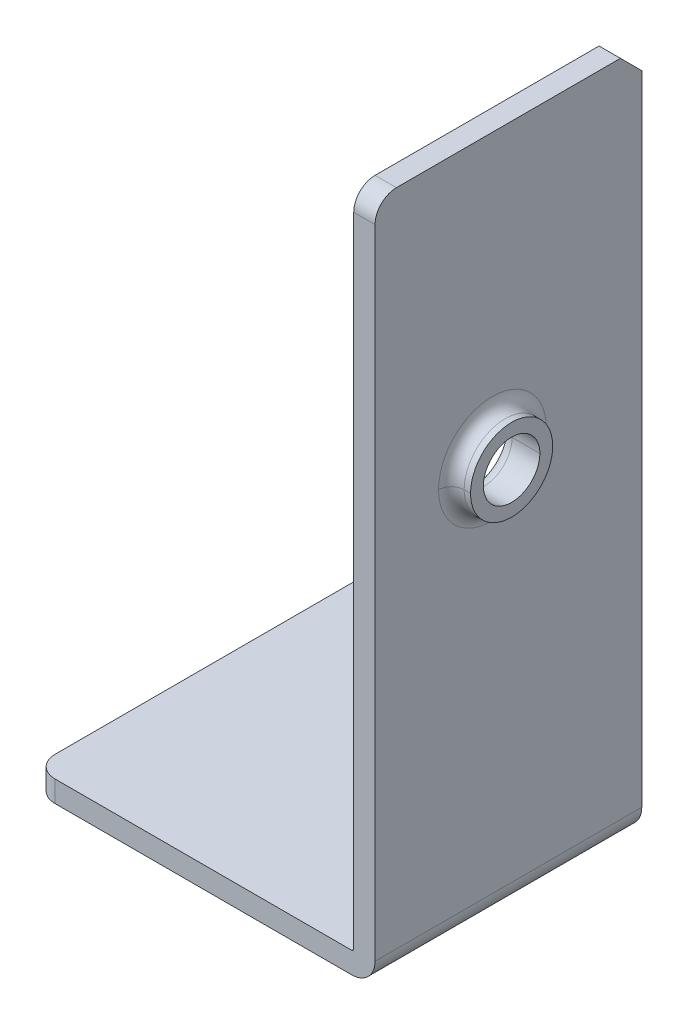
ISO-10303-21;
HEADER;
FILE_DESCRIPTION(('STEP AP214'),'2;1');
FILE_NAME('part.step','',(''),(''),'','','');
FILE_SCHEMA(('AUTOMOTIVE_DESIGN { 1 0 10303 214 1 1 1 1 }'));
ENDSEC;
DATA;
#1=APPLICATION_CONTEXT('core data for automotive mechanical design processes');
#2=APPLICATION_PROTOCOL_DEFINITION('international standard','automotive_design',2000,#1);
#3=PRODUCT_CONTEXT('',#1,'mechanical');
#4=PRODUCT('Part','Part','',(#3));
#5=PRODUCT_RELATED_PRODUCT_CATEGORY('part','',(#4));
#6=PRODUCT_DEFINITION_FORMATION('','',#4);
#7=PRODUCT_DEFINITION_CONTEXT('part definition',#1,'design');
#8=PRODUCT_DEFINITION('design','',#6,#7);
#9=PRODUCT_DEFINITION_SHAPE('','',#8);
#10=(LENGTH_UNIT() NAMED_UNIT(*) SI_UNIT(.MILLI.,.METRE.));
#11=(NAMED_UNIT(*) PLANE_ANGLE_UNIT() SI_UNIT($,.RADIAN.));
#12=(NAMED_UNIT(*) SI_UNIT($,.STERADIAN.) SOLID_ANGLE_UNIT());
#13=UNCERTAINTY_MEASURE_WITH_UNIT(LENGTH_MEASURE(1.E-05),#10,'distance_accuracy_value','');
#14=(GEOMETRIC_REPRESENTATION_CONTEXT(3) GLOBAL_UNCERTAINTY_ASSIGNED_CONTEXT((#13)) GLOBAL_UNIT_ASSIGNED_CONTEXT((#10,
#11,#12)) REPRESENTATION_CONTEXT('',''));
#15=CARTESIAN_POINT('',(0.,0.,0.));
#16=DIRECTION('',(0.,0.,1.));
#17=DIRECTION('',(1.,0.,0.));
#18=AXIS2_PLACEMENT_3D('',#15,#16,#17);
#19=CARTESIAN_POINT('',(-229.56652480921,281.7745818723,13.));
#20=DIRECTION('',(-1.,0.,0.));
#21=DIRECTION('',(0.,0.,1.));
#22=AXIS2_PLACEMENT_3D('',#19,#20,#21);
#23=TOROIDAL_SURFACE('',#22,2.525,0.6);
#24=CARTESIAN_POINT('',(-229.56652480921,281.7745818723,15.525));
#25=DIRECTION('',(0.,-1.,0.));
#26=DIRECTION('',(-1.,0.,0.));
#27=AXIS2_PLACEMENT_3D('',#24,#25,#26);
#28=CIRCLE('',#27,0.6);
#29=CARTESIAN_POINT('',(-230.16652480921,281.7745818723,15.525));
#30=VERTEX_POINT('',#29);
#31=CARTESIAN_POINT('',(-229.56652480921,281.7745818723,14.925));
#32=VERTEX_POINT('',#31);
#33=EDGE_CURVE('E11',#30,#32,#28,.T.);
#34=ORIENTED_EDGE('',*,*,#33,.F.);
#35=CARTESIAN_POINT('',(-230.16652480921,281.7745818723,13.));
#36=DIRECTION('',(-1.,0.,0.));
#37=DIRECTION('',(0.,0.,-1.));
#38=AXIS2_PLACEMENT_3D('',#35,#36,#37);
#39=CIRCLE('',#38,2.525);
#40=CARTESIAN_POINT('',(-230.16652480921,281.7745818723,10.475));
#41=VERTEX_POINT('',#40);
#42=EDGE_CURVE('E190',#41,#30,#39,.T.);
#43=ORIENTED_EDGE('',*,*,#42,.F.);
#44=CARTESIAN_POINT('',(-229.56652480921,281.7745818723,10.475));
#45=DIRECTION('',(0.,1.,0.));
#46=DIRECTION('',(-1.,0.,0.));
#47=AXIS2_PLACEMENT_3D('',#44,#45,#46);
#48=CIRCLE('',#47,0.6);
#49=CARTESIAN_POINT('',(-229.56652480921,281.7745818723,11.075));
#50=VERTEX_POINT('',#49);
#51=EDGE_CURVE('E25',#41,#50,#48,.T.);
#52=ORIENTED_EDGE('',*,*,#51,.T.);
#53=CARTESIAN_POINT('',(-229.56652480921,281.7745818723,13.));
#54=DIRECTION('',(-1.,0.,0.));
#55=DIRECTION('',(0.,0.,-1.));
#56=AXIS2_PLACEMENT_3D('',#53,#54,#55);
#57=CIRCLE('',#56,1.925);
#58=EDGE_CURVE('E76',#50,#32,#57,.T.);
#59=ORIENTED_EDGE('',*,*,#58,.T.);
#60=EDGE_LOOP('',(#34,#43,#52,#59));
#61=FACE_BOUND('',#60,.T.);
#62=ADVANCED_FACE('F16',(#61),#23,.F.);
#63=CARTESIAN_POINT('',(-229.56652480921,281.7745818723,13.));
#64=DIRECTION('',(-1.,0.,0.));
#65=DIRECTION('',(0.,0.,1.));
#66=AXIS2_PLACEMENT_3D('',#63,#64,#65);
#67=TOROIDAL_SURFACE('',#66,2.525,0.6);
#68=CARTESIAN_POINT('',(-229.56652480921,281.7745818723,13.));
#69=DIRECTION('',(-1.,0.,0.));
#70=DIRECTION('',(0.,0.,1.));
#71=AXIS2_PLACEMENT_3D('',#68,#69,#70);
#72=CIRCLE('',#71,1.925);
#73=EDGE_CURVE('E72',#32,#50,#72,.T.);
#74=ORIENTED_EDGE('',*,*,#73,.T.);
#75=ORIENTED_EDGE('',*,*,#51,.F.);
#76=CARTESIAN_POINT('',(-230.16652480921,281.7745818723,13.));
#77=DIRECTION('',(-1.,0.,0.));
#78=DIRECTION('',(0.,0.,1.));
#79=AXIS2_PLACEMENT_3D('',#76,#77,#78);
#80=CIRCLE('',#79,2.525);
#81=EDGE_CURVE('E186',#30,#41,#80,.T.);
#82=ORIENTED_EDGE('',*,*,#81,.F.);
#83=ORIENTED_EDGE('',*,*,#33,.T.);
#84=EDGE_LOOP('',(#74,#75,#82,#83));
#85=FACE_BOUND('',#84,.T.);
#86=ADVANCED_FACE('F689',(#85),#67,.F.);
#87=CARTESIAN_POINT('',(-229.41652480921,281.7745818723,13.));
#88=DIRECTION('',(-1.,0.,0.));
#89=DIRECTION('',(0.,0.,1.));
#90=AXIS2_PLACEMENT_3D('',#87,#88,#89);
#91=CYLINDRICAL_SURFACE('',#90,1.925);
#92=CARTESIAN_POINT('',(-229.26652480921,281.7745818723,13.));
#93=DIRECTION('',(1.,0.,0.));
#94=DIRECTION('',(0.,0.,-1.));
#95=AXIS2_PLACEMENT_3D('',#92,#93,#94);
#96=CIRCLE('',#95,1.925);
#97=CARTESIAN_POINT('',(-229.26652480921,281.7745818723,11.075));
#98=VERTEX_POINT('',#97);
#99=CARTESIAN_POINT('',(-229.26652480921,281.7745818723,14.925));
#100=VERTEX_POINT('',#99);
#101=EDGE_CURVE('E71',#98,#100,#96,.T.);
#102=ORIENTED_EDGE('',*,*,#101,.F.);
#103=DIRECTION('',(1.,0.,0.));
#104=VECTOR('',#103,1.);
#105=CARTESIAN_POINT('',(-229.56652480921,281.7745818723,11.075));
#106=LINE('',#105,#104);
#107=EDGE_CURVE('E81',#50,#98,#106,.T.);
#108=ORIENTED_EDGE('',*,*,#107,.F.);
#109=ORIENTED_EDGE('',*,*,#73,.F.);
#110=DIRECTION('',(1.,0.,0.));
#111=VECTOR('',#110,1.);
#112=CARTESIAN_POINT('',(-229.56652480921,281.7745818723,14.925));
#113=LINE('',#112,#111);
#114=EDGE_CURVE('E66',#32,#100,#113,.T.);
#115=ORIENTED_EDGE('',*,*,#114,.T.);
#116=EDGE_LOOP('',(#102,#108,#109,#115));
#117=FACE_BOUND('',#116,.T.);
#118=ADVANCED_FACE('F68',(#117),#91,.T.);
#119=CARTESIAN_POINT('',(-229.41652480921,281.7745818723,13.));
#120=DIRECTION('',(-1.,0.,0.));
#121=DIRECTION('',(0.,0.,1.));
#122=AXIS2_PLACEMENT_3D('',#119,#120,#121);
#123=CYLINDRICAL_SURFACE('',#122,1.925);
#124=ORIENTED_EDGE('',*,*,#114,.F.);
#125=ORIENTED_EDGE('',*,*,#58,.F.);
#126=ORIENTED_EDGE('',*,*,#107,.T.);
#127=CARTESIAN_POINT('',(-229.26652480921,281.7745818723,13.));
#128=DIRECTION('',(1.,0.,0.));
#129=DIRECTION('',(0.,0.,1.));
#130=AXIS2_PLACEMENT_3D('',#127,#128,#129);
#131=CIRCLE('',#130,1.925);
#132=EDGE_CURVE('E77',#100,#98,#131,.T.);
#133=ORIENTED_EDGE('',*,*,#132,.F.);
#134=EDGE_LOOP('',(#124,#125,#126,#133));
#135=FACE_BOUND('',#134,.T.);
#136=ADVANCED_FACE('F80',(#135),#123,.T.);
#137=CARTESIAN_POINT('',(-229.26652480921,281.7745818723,14.625));
#138=DIRECTION('',(-1.,0.,0.));
#139=DIRECTION('',(0.,-1.,0.));
#140=AXIS2_PLACEMENT_3D('',#137,#138,#139);
#141=PLANE('',#140);
#142=CARTESIAN_POINT('',(-229.26652480921,281.7745818723,13.));
#143=DIRECTION('',(-1.,0.,0.));
#144=DIRECTION('',(0.,0.,1.));
#145=AXIS2_PLACEMENT_3D('',#142,#143,#144);
#146=CIRCLE('',#145,1.325);
#147=CARTESIAN_POINT('',(-229.26652480921,281.7745818723,14.325));
#148=VERTEX_POINT('',#147);
#149=CARTESIAN_POINT('',(-229.26652480921,281.7745818723,11.675));
#150=VERTEX_POINT('',#149);
#151=EDGE_CURVE('E150',#148,#150,#146,.T.);
#152=ORIENTED_EDGE('',*,*,#151,.T.);
#153=CARTESIAN_POINT('',(-229.26652480921,281.7745818723,13.));
#154=DIRECTION('',(-1.,0.,0.));
#155=DIRECTION('',(0.,0.,-1.));
#156=AXIS2_PLACEMENT_3D('',#153,#154,#155);
#157=CIRCLE('',#156,1.325);
#158=EDGE_CURVE('E87',#150,#148,#157,.T.);
#159=ORIENTED_EDGE('',*,*,#158,.T.);
#160=EDGE_LOOP('',(#152,#159));
#161=FACE_BOUND('',#160,.T.);
#162=ORIENTED_EDGE('',*,*,#101,.T.);
#163=ORIENTED_EDGE('',*,*,#132,.T.);
#164=EDGE_LOOP('',(#162,#163));
#165=FACE_BOUND('',#164,.T.);
#166=ADVANCED_FACE('F85',(#161,#165),#141,.F.);
#167=CARTESIAN_POINT('',(-229.91652480921,281.7745818723,13.));
#168=DIRECTION('',(-1.,0.,0.));
#169=DIRECTION('',(0.,0.,1.));
#170=AXIS2_PLACEMENT_3D('',#167,#168,#169);
#171=CYLINDRICAL_SURFACE('',#170,1.325);
#172=DIRECTION('',(1.,0.,0.));
#173=VECTOR('',#172,1.);
#174=CARTESIAN_POINT('',(-230.56652480921,281.7745818723,14.325));
#175=LINE('',#174,#173);
#176=CARTESIAN_POINT('',(-230.56652480921,281.7745818723,14.325));
#177=VERTEX_POINT('',#176);
#178=EDGE_CURVE('E95',#177,#148,#175,.T.);
#179=ORIENTED_EDGE('',*,*,#178,.T.);
#180=ORIENTED_EDGE('',*,*,#158,.F.);
#181=DIRECTION('',(1.,0.,0.));
#182=VECTOR('',#181,1.);
#183=CARTESIAN_POINT('',(-230.56652480921,281.7745818723,11.675));
#184=LINE('',#183,#182);
#185=CARTESIAN_POINT('',(-230.56652480921,281.7745818723,11.675));
#186=VERTEX_POINT('',#185);
#187=EDGE_CURVE('E250',#186,#150,#184,.T.);
#188=ORIENTED_EDGE('',*,*,#187,.F.);
#189=CARTESIAN_POINT('',(-230.56652480921,281.7745818723,13.));
#190=DIRECTION('',(1.,0.,0.));
#191=DIRECTION('',(0.,0.,1.));
#192=AXIS2_PLACEMENT_3D('',#189,#190,#191);
#193=CIRCLE('',#192,1.325);
#194=EDGE_CURVE('E238',#177,#186,#193,.T.);
#195=ORIENTED_EDGE('',*,*,#194,.F.);
#196=EDGE_LOOP('',(#179,#180,#188,#195));
#197=FACE_BOUND('',#196,.T.);
#198=ADVANCED_FACE('F733',(#197),#171,.F.);
#199=CARTESIAN_POINT('',(-229.91652480921,281.7745818723,13.));
#200=DIRECTION('',(-1.,0.,0.));
#201=DIRECTION('',(0.,0.,1.));
#202=AXIS2_PLACEMENT_3D('',#199,#200,#201);
#203=CYLINDRICAL_SURFACE('',#202,1.325);
#204=CARTESIAN_POINT('',(-230.56652480921,281.7745818723,13.));
#205=DIRECTION('',(1.,0.,0.));
#206=DIRECTION('',(0.,0.,-1.));
#207=AXIS2_PLACEMENT_3D('',#204,#205,#206);
#208=CIRCLE('',#207,1.325);
#209=EDGE_CURVE('E246',#186,#177,#208,.T.);
#210=ORIENTED_EDGE('',*,*,#209,.F.);
#211=ORIENTED_EDGE('',*,*,#187,.T.);
#212=ORIENTED_EDGE('',*,*,#151,.F.);
#213=ORIENTED_EDGE('',*,*,#178,.F.);
#214=EDGE_LOOP('',(#210,#211,#212,#213));
#215=FACE_BOUND('',#214,.T.);
#216=ADVANCED_FACE('F711',(#215),#203,.F.);
#217=CARTESIAN_POINT('',(-230.56652480921,281.7745818723,13.));
#218=DIRECTION('',(-1.,0.,0.));
#219=DIRECTION('',(0.,0.,1.));
#220=AXIS2_PLACEMENT_3D('',#217,#218,#219);
#221=TOROIDAL_SURFACE('',#220,1.925,0.6);
#222=CARTESIAN_POINT('',(-231.16652480921,281.7745818723,13.));
#223=DIRECTION('',(1.,0.,0.));
#224=DIRECTION('',(0.,0.,-1.));
#225=AXIS2_PLACEMENT_3D('',#222,#223,#224);
#226=CIRCLE('',#225,1.925);
#227=CARTESIAN_POINT('',(-231.16652480921,281.7745818723,11.075));
#228=VERTEX_POINT('',#227);
#229=CARTESIAN_POINT('',(-231.16652480921,281.7745818723,14.925));
#230=VERTEX_POINT('',#229);
#231=EDGE_CURVE('E229',#228,#230,#226,.T.);
#232=ORIENTED_EDGE('',*,*,#231,.F.);
#233=CARTESIAN_POINT('',(-230.56652480921,281.7745818723,11.075));
#234=DIRECTION('',(0.,1.,0.));
#235=DIRECTION('',(-1.,0.,0.));
#236=AXIS2_PLACEMENT_3D('',#233,#234,#235);
#237=CIRCLE('',#236,0.6);
#238=EDGE_CURVE('E242',#228,#186,#237,.T.);
#239=ORIENTED_EDGE('',*,*,#238,.T.);
#240=ORIENTED_EDGE('',*,*,#209,.T.);
#241=CARTESIAN_POINT('',(-230.56652480921,281.7745818723,14.925));
#242=DIRECTION('',(0.,-1.,0.));
#243=DIRECTION('',(-1.,0.,0.));
#244=AXIS2_PLACEMENT_3D('',#241,#242,#243);
#245=CIRCLE('',#244,0.6);
#246=EDGE_CURVE('E234',#230,#177,#245,.T.);
#247=ORIENTED_EDGE('',*,*,#246,.F.);
#248=EDGE_LOOP('',(#232,#239,#240,#247));
#249=FACE_BOUND('',#248,.T.);
#250=ADVANCED_FACE('F707',(#249),#221,.T.);
#251=CARTESIAN_POINT('',(-230.56652480921,281.7745818723,13.));
#252=DIRECTION('',(-1.,0.,0.));
#253=DIRECTION('',(0.,0.,1.));
#254=AXIS2_PLACEMENT_3D('',#251,#252,#253);
#255=TOROIDAL_SURFACE('',#254,1.925,0.6);
#256=ORIENTED_EDGE('',*,*,#246,.T.);
#257=ORIENTED_EDGE('',*,*,#194,.T.);
#258=ORIENTED_EDGE('',*,*,#238,.F.);
#259=CARTESIAN_POINT('',(-231.16652480921,281.7745818723,13.));
#260=DIRECTION('',(1.,0.,0.));
#261=DIRECTION('',(0.,0.,1.));
#262=AXIS2_PLACEMENT_3D('',#259,#260,#261);
#263=CIRCLE('',#262,1.925);
#264=EDGE_CURVE('E233',#230,#228,#263,.T.);
#265=ORIENTED_EDGE('',*,*,#264,.F.);
#266=EDGE_LOOP('',(#256,#257,#258,#265));
#267=FACE_BOUND('',#266,.T.);
#268=ADVANCED_FACE('F710',(#267),#255,.T.);
#269=CARTESIAN_POINT('',(-231.26652480921,264.1245789185,23.4));
#270=DIRECTION('',(0.,0.,1.));
#271=DIRECTION('',(-1.,0.,0.));
#272=AXIS2_PLACEMENT_3D('',#269,#270,#271);
#273=CYLINDRICAL_SURFACE('',#272,0.1);
#274=CARTESIAN_POINT('',(-231.26652480921,264.1245789185,18.5));
#275=DIRECTION('',(0.,0.,-1.));
#276=DIRECTION('',(1.,-8.526512829122E-13,0.));
#277=AXIS2_PLACEMENT_3D('',#274,#275,#276);
#278=CIRCLE('',#277,0.1);
#279=CARTESIAN_POINT('',(-231.16652480921,264.1245789185,18.5));
#280=VERTEX_POINT('',#279);
#281=CARTESIAN_POINT('',(-231.26652480921,264.0245789185,18.5));
#282=VERTEX_POINT('',#281);
#283=EDGE_CURVE('E124',#280,#282,#278,.T.);
#284=ORIENTED_EDGE('',*,*,#283,.F.);
#285=DIRECTION('',(0.,0.,-1.));
#286=VECTOR('',#285,1.);
#287=CARTESIAN_POINT('',(-231.16652480921,264.1245789185,18.5));
#288=LINE('',#287,#286);
#289=CARTESIAN_POINT('',(-231.16652480921,264.1245789185,5.99999999999991));
#290=VERTEX_POINT('',#289);
#291=EDGE_CURVE('E225',#280,#290,#288,.T.);
#292=ORIENTED_EDGE('',*,*,#291,.T.);
#293=CARTESIAN_POINT('',(-231.26652480921,264.1245789185,5.99999999999991));
#294=DIRECTION('',(0.,0.,1.));
#295=DIRECTION('',(-1.42108547152E-12,-1.,0.));
#296=AXIS2_PLACEMENT_3D('',#293,#294,#295);
#297=CIRCLE('',#296,0.1);
#298=CARTESIAN_POINT('',(-231.26652480921,264.0245789185,5.99999999999991));
#299=VERTEX_POINT('',#298);
#300=EDGE_CURVE('E194',#299,#290,#297,.T.);
#301=ORIENTED_EDGE('',*,*,#300,.F.);
#302=DIRECTION('',(0.,0.,1.));
#303=VECTOR('',#302,1.);
#304=CARTESIAN_POINT('',(-231.26652480921,264.0245789185,5.99999999999991));
#305=LINE('',#304,#303);
#306=EDGE_CURVE('E99',#299,#282,#305,.T.);
#307=ORIENTED_EDGE('',*,*,#306,.T.);
#308=EDGE_LOOP('',(#284,#292,#301,#307));
#309=FACE_BOUND('',#308,.T.);
#310=ADVANCED_FACE('F651',(#309),#273,.F.);
#311=CARTESIAN_POINT('',(-231.16652480921,334.17457891819,0.));
#312=DIRECTION('',(-1.,0.,0.));
#313=DIRECTION('',(0.,-1.,0.));
#314=AXIS2_PLACEMENT_3D('',#311,#312,#313);
#315=PLANE('',#314);
#316=ORIENTED_EDGE('',*,*,#231,.T.);
#317=ORIENTED_EDGE('',*,*,#264,.T.);
#318=EDGE_LOOP('',(#316,#317));
#319=FACE_BOUND('',#318,.T.);
#320=DIRECTION('',(0.,-1.,0.));
#321=VECTOR('',#320,1.);
#322=CARTESIAN_POINT('',(-231.16652480921,294.0245788262,18.5));
#323=LINE('',#322,#321);
#324=CARTESIAN_POINT('',(-231.16652480921,294.0245788262,18.5));
#325=VERTEX_POINT('',#324);
#326=EDGE_CURVE('E119',#325,#280,#323,.T.);
#327=ORIENTED_EDGE('',*,*,#326,.F.);
#328=CARTESIAN_POINT('',(-231.16652480921,294.0245788262,17.5));
#329=DIRECTION('',(-1.,0.,0.));
#330=DIRECTION('',(0.,-7.531752999057E-13,1.));
#331=AXIS2_PLACEMENT_3D('',#328,#329,#330);
#332=CIRCLE('',#331,1.);
#333=CARTESIAN_POINT('',(-231.16652480921,295.0245788262,17.5));
#334=VERTEX_POINT('',#333);
#335=EDGE_CURVE('E222',#325,#334,#332,.T.);
#336=ORIENTED_EDGE('',*,*,#335,.T.);
#337=DIRECTION('',(0.,0.,-1.));
#338=VECTOR('',#337,1.);
#339=CARTESIAN_POINT('',(-231.16652480921,295.0245788262,17.5));
#340=LINE('',#339,#338);
#341=CARTESIAN_POINT('',(-231.16652480921,295.0245788262,6.99999999999991));
#342=VERTEX_POINT('',#341);
#343=EDGE_CURVE('E214',#334,#342,#340,.T.);
#344=ORIENTED_EDGE('',*,*,#343,.T.);
#345=DIRECTION('',(0.,-0.707106781186548,-0.707106781186548));
#346=VECTOR('',#345,1.);
#347=CARTESIAN_POINT('',(-231.16652480921,295.0245788262,6.99999999999991));
#348=LINE('',#347,#346);
#349=CARTESIAN_POINT('',(-231.16652480921,294.0245788262,5.99999999999991));
#350=VERTEX_POINT('',#349);
#351=EDGE_CURVE('E206',#342,#350,#348,.T.);
#352=ORIENTED_EDGE('',*,*,#351,.T.);
#353=DIRECTION('',(0.,-1.,0.));
#354=VECTOR('',#353,1.);
#355=CARTESIAN_POINT('',(-231.16652480921,294.0245788262,5.99999999999991));
#356=LINE('',#355,#354);
#357=EDGE_CURVE('E198',#350,#290,#356,.T.);
#358=ORIENTED_EDGE('',*,*,#357,.T.);
#359=ORIENTED_EDGE('',*,*,#291,.F.);
#360=EDGE_LOOP('',(#327,#336,#344,#352,#358,#359));
#361=FACE_BOUND('',#360,.T.);
#362=ADVANCED_FACE('F637',(#319,#361),#315,.T.);
#363=CARTESIAN_POINT('',(-23.81462961831,294.0245788262,17.5));
#364=DIRECTION('',(-1.,0.,0.));
#365=DIRECTION('',(0.,0.,-1.));
#366=AXIS2_PLACEMENT_3D('',#363,#364,#365);
#367=CYLINDRICAL_SURFACE('',#366,1.);
#368=ORIENTED_EDGE('',*,*,#335,.F.);
#369=DIRECTION('',(1.,0.,0.));
#370=VECTOR('',#369,1.);
#371=CARTESIAN_POINT('',(-231.16652480921,294.0245788262,18.5));
#372=LINE('',#371,#370);
#373=CARTESIAN_POINT('',(-230.16652480921,294.0245788262,18.5));
#374=VERTEX_POINT('',#373);
#375=EDGE_CURVE('E115',#325,#374,#372,.T.);
#376=ORIENTED_EDGE('',*,*,#375,.T.);
#377=CARTESIAN_POINT('',(-230.16652480921,294.0245788262,17.5));
#378=DIRECTION('',(1.,0.,0.));
#379=DIRECTION('',(0.,1.,0.));
#380=AXIS2_PLACEMENT_3D('',#377,#378,#379);
#381=CIRCLE('',#380,1.);
#382=CARTESIAN_POINT('',(-230.16652480921,295.0245788262,17.5));
#383=VERTEX_POINT('',#382);
#384=EDGE_CURVE('E176',#383,#374,#381,.T.);
#385=ORIENTED_EDGE('',*,*,#384,.F.);
#386=DIRECTION('',(-1.,0.,0.));
#387=VECTOR('',#386,1.);
#388=CARTESIAN_POINT('',(-230.16652480921,295.0245788262,17.5));
#389=LINE('',#388,#387);
#390=EDGE_CURVE('E218',#383,#334,#389,.T.);
#391=ORIENTED_EDGE('',*,*,#390,.T.);
#392=EDGE_LOOP('',(#368,#376,#385,#391));
#393=FACE_BOUND('',#392,.T.);
#394=ADVANCED_FACE('F659',(#393),#367,.T.);
#395=CARTESIAN_POINT('',(-225.41652240921,295.0245788262,29.2852188387399));
#396=DIRECTION('',(0.,-1.,0.));
#397=DIRECTION('',(-1.,0.,0.));
#398=AXIS2_PLACEMENT_3D('',#395,#396,#397);
#399=PLANE('',#398);
#400=DIRECTION('',(0.,0.,1.));
#401=VECTOR('',#400,1.);
#402=CARTESIAN_POINT('',(-230.16652480921,295.0245788262,6.99999999999991));
#403=LINE('',#402,#401);
#404=CARTESIAN_POINT('',(-230.16652480921,295.0245788262,6.99999999999991));
#405=VERTEX_POINT('',#404);
#406=EDGE_CURVE('E172',#405,#383,#403,.T.);
#407=ORIENTED_EDGE('',*,*,#406,.F.);
#408=DIRECTION('',(1.,0.,0.));
#409=VECTOR('',#408,1.);
#410=CARTESIAN_POINT('',(-231.16652480921,295.0245788262,6.99999999999991));
#411=LINE('',#410,#409);
#412=EDGE_CURVE('E210',#342,#405,#411,.T.);
#413=ORIENTED_EDGE('',*,*,#412,.F.);
#414=ORIENTED_EDGE('',*,*,#343,.F.);
#415=ORIENTED_EDGE('',*,*,#390,.F.);
#416=EDGE_LOOP('',(#407,#413,#414,#415));
#417=FACE_BOUND('',#416,.T.);
#418=ADVANCED_FACE('F640',(#417),#399,.F.);
#419=CARTESIAN_POINT('',(-230.66652480921,294.5245788262,6.49999999999991));
#420=DIRECTION('',(0.,-0.707106781186598,0.707106781186498));
#421=DIRECTION('',(-1.,0.,0.));
#422=AXIS2_PLACEMENT_3D('',#419,#420,#421);
#423=PLANE('',#422);
#424=ORIENTED_EDGE('',*,*,#351,.F.);
#425=ORIENTED_EDGE('',*,*,#412,.T.);
#426=DIRECTION('',(0.,0.707106781186548,0.707106781186548));
#427=VECTOR('',#426,1.);
#428=CARTESIAN_POINT('',(-230.16652480921,294.0245788262,5.99999999999991));
#429=LINE('',#428,#427);
#430=CARTESIAN_POINT('',(-230.16652480921,294.0245788262,5.99999999999991));
#431=VERTEX_POINT('',#430);
#432=EDGE_CURVE('E166',#431,#405,#429,.T.);
#433=ORIENTED_EDGE('',*,*,#432,.F.);
#434=DIRECTION('',(1.,0.,0.));
#435=VECTOR('',#434,1.);
#436=CARTESIAN_POINT('',(-231.16652480921,294.0245788262,5.99999999999991));
#437=LINE('',#436,#435);
#438=EDGE_CURVE('E202',#350,#431,#437,.T.);
#439=ORIENTED_EDGE('',*,*,#438,.F.);
#440=EDGE_LOOP('',(#424,#425,#433,#439));
#441=FACE_BOUND('',#440,.T.);
#442=ADVANCED_FACE('F643',(#441),#423,.F.);
#443=CARTESIAN_POINT('',(-221.57063322721,261.5245789185,5.99999999999991));
#444=DIRECTION('',(0.,0.,1.));
#445=DIRECTION('',(-1.,0.,0.));
#446=AXIS2_PLACEMENT_3D('',#443,#444,#445);
#447=PLANE('',#446);
#448=DIRECTION('',(0.,1.,0.));
#449=VECTOR('',#448,1.);
#450=CARTESIAN_POINT('',(-230.16652480921,264.1245789185,5.99999999999991));
#451=LINE('',#450,#449);
#452=CARTESIAN_POINT('',(-230.16652480921,264.1245789185,5.99999999999991));
#453=VERTEX_POINT('',#452);
#454=EDGE_CURVE('E180',#453,#431,#451,.T.);
#455=ORIENTED_EDGE('',*,*,#454,.F.);
#456=CARTESIAN_POINT('',(-231.26652480921,264.1245789185,5.99999999999991));
#457=DIRECTION('',(0.,0.,-1.));
#458=DIRECTION('',(1.,0.,0.));
#459=AXIS2_PLACEMENT_3D('',#456,#457,#458);
#460=CIRCLE('',#459,1.1);
#461=CARTESIAN_POINT('',(-231.26652480921,263.0245789185,5.99999999999991));
#462=VERTEX_POINT('',#461);
#463=EDGE_CURVE('E158',#453,#462,#460,.T.);
#464=ORIENTED_EDGE('',*,*,#463,.T.);
#465=DIRECTION('',(1.,0.,0.));
#466=VECTOR('',#465,1.);
#467=CARTESIAN_POINT('',(-240.41652711801,263.0245789185,5.99999999999991));
#468=LINE('',#467,#466);
#469=CARTESIAN_POINT('',(-240.41652711801,263.0245789185,5.99999999999991));
#470=VERTEX_POINT('',#469);
#471=EDGE_CURVE('E142',#470,#462,#468,.T.);
#472=ORIENTED_EDGE('',*,*,#471,.F.);
#473=DIRECTION('',(0.,-1.,0.));
#474=VECTOR('',#473,1.);
#475=CARTESIAN_POINT('',(-240.41652711801,264.0245789185,5.99999999999991));
#476=LINE('',#475,#474);
#477=CARTESIAN_POINT('',(-240.41652711801,264.0245789185,5.99999999999991));
#478=VERTEX_POINT('',#477);
#479=EDGE_CURVE('E471',#478,#470,#476,.T.);
#480=ORIENTED_EDGE('',*,*,#479,.F.);
#481=DIRECTION('',(-1.,0.,0.));
#482=VECTOR('',#481,1.);
#483=CARTESIAN_POINT('',(-231.26652480921,264.0245789185,5.99999999999991));
#484=LINE('',#483,#482);
#485=EDGE_CURVE('E106',#299,#478,#484,.T.);
#486=ORIENTED_EDGE('',*,*,#485,.F.);
#487=ORIENTED_EDGE('',*,*,#300,.T.);
#488=ORIENTED_EDGE('',*,*,#357,.F.);
#489=ORIENTED_EDGE('',*,*,#438,.T.);
#490=EDGE_LOOP('',(#455,#464,#472,#480,#486,#487,#488,#489));
#491=FACE_BOUND('',#490,.T.);
#492=ADVANCED_FACE('F646',(#491),#447,.F.);
#493=CARTESIAN_POINT('',(-230.16652480921,264.1245789185,26.));
#494=DIRECTION('',(1.,0.,0.));
#495=DIRECTION('',(0.,0.,1.));
#496=AXIS2_PLACEMENT_3D('',#493,#494,#495);
#497=PLANE('',#496);
#498=ORIENTED_EDGE('',*,*,#81,.T.);
#499=ORIENTED_EDGE('',*,*,#42,.T.);
#500=EDGE_LOOP('',(#498,#499));
#501=FACE_BOUND('',#500,.T.);
#502=ORIENTED_EDGE('',*,*,#432,.T.);
#503=ORIENTED_EDGE('',*,*,#406,.T.);
#504=ORIENTED_EDGE('',*,*,#384,.T.);
#505=DIRECTION('',(0.,1.,0.));
#506=VECTOR('',#505,1.);
#507=CARTESIAN_POINT('',(-230.16652480921,264.1245789185,18.5));
#508=LINE('',#507,#506);
#509=CARTESIAN_POINT('',(-230.16652480921,264.1245789185,18.5));
#510=VERTEX_POINT('',#509);
#511=EDGE_CURVE('E120',#510,#374,#508,.T.);
#512=ORIENTED_EDGE('',*,*,#511,.F.);
#513=DIRECTION('',(0.,0.,1.));
#514=VECTOR('',#513,1.);
#515=CARTESIAN_POINT('',(-230.16652480921,264.1245789185,5.99999999999991));
#516=LINE('',#515,#514);
#517=EDGE_CURVE('E162',#453,#510,#516,.T.);
#518=ORIENTED_EDGE('',*,*,#517,.F.);
#519=ORIENTED_EDGE('',*,*,#454,.T.);
#520=EDGE_LOOP('',(#502,#503,#504,#512,#518,#519));
#521=FACE_BOUND('',#520,.T.);
#522=ADVANCED_FACE('F661',(#501,#521),#497,.T.);
#523=CARTESIAN_POINT('',(-231.26652480921,264.1245789185,23.4));
#524=DIRECTION('',(0.,0.,1.));
#525=DIRECTION('',(-1.,0.,0.));
#526=AXIS2_PLACEMENT_3D('',#523,#524,#525);
#527=CYLINDRICAL_SURFACE('',#526,1.1);
#528=CARTESIAN_POINT('',(-231.26652480921,264.1245789185,18.5));
#529=DIRECTION('',(0.,0.,1.));
#530=DIRECTION('',(-2.84217094304E-13,-1.,0.));
#531=AXIS2_PLACEMENT_3D('',#528,#529,#530);
#532=CIRCLE('',#531,1.1);
#533=CARTESIAN_POINT('',(-231.26652480921,263.0245789185,18.5));
#534=VERTEX_POINT('',#533);
#535=EDGE_CURVE('E104',#534,#510,#532,.T.);
#536=ORIENTED_EDGE('',*,*,#535,.F.);
#537=DIRECTION('',(0.,0.,-1.));
#538=VECTOR('',#537,1.);
#539=CARTESIAN_POINT('',(-231.26652480921,263.0245789185,18.5));
#540=LINE('',#539,#538);
#541=EDGE_CURVE('E146',#534,#462,#540,.T.);
#542=ORIENTED_EDGE('',*,*,#541,.T.);
#543=ORIENTED_EDGE('',*,*,#463,.F.);
#544=ORIENTED_EDGE('',*,*,#517,.T.);
#545=EDGE_LOOP('',(#536,#542,#543,#544));
#546=FACE_BOUND('',#545,.T.);
#547=ADVANCED_FACE('F667',(#546),#527,.T.);
#548=CARTESIAN_POINT('',(-246.16652480911,261.5245789185,0.));
#549=DIRECTION('',(-1.,0.,0.));
#550=DIRECTION('',(0.,-1.,0.));
#551=AXIS2_PLACEMENT_3D('',#548,#549,#550);
#552=PLANE('',#551);
#553=DIRECTION('',(0.,0.,-1.));
#554=VECTOR('',#553,1.);
#555=CARTESIAN_POINT('',(-246.16652480911,264.0245789185,17.5));
#556=LINE('',#555,#554);
#557=CARTESIAN_POINT('',(-246.16652480911,264.0245789185,17.5));
#558=VERTEX_POINT('',#557);
#559=CARTESIAN_POINT('',(-246.16652480911,264.0245789185,0.));
#560=VERTEX_POINT('',#559);
#561=EDGE_CURVE('E110',#558,#560,#556,.T.);
#562=ORIENTED_EDGE('',*,*,#561,.T.);
#563=DIRECTION('',(0.,1.,0.));
#564=VECTOR('',#563,1.);
#565=CARTESIAN_POINT('',(-246.16652480911,263.0245789185,0.));
#566=LINE('',#565,#564);
#567=CARTESIAN_POINT('',(-246.16652480911,263.0245789185,0.));
#568=VERTEX_POINT('',#567);
#569=EDGE_CURVE('E520',#568,#560,#566,.T.);
#570=ORIENTED_EDGE('',*,*,#569,.F.);
#571=DIRECTION('',(0.,0.,1.));
#572=VECTOR('',#571,1.);
#573=CARTESIAN_POINT('',(-246.16652480911,263.0245789185,0.));
#574=LINE('',#573,#572);
#575=CARTESIAN_POINT('',(-246.16652480911,263.0245789185,17.5));
#576=VERTEX_POINT('',#575);
#577=EDGE_CURVE('E154',#568,#576,#574,.T.);
#578=ORIENTED_EDGE('',*,*,#577,.T.);
#579=DIRECTION('',(0.,-1.,0.));
#580=VECTOR('',#579,1.);
#581=CARTESIAN_POINT('',(-246.16652480911,264.0245789185,17.5));
#582=LINE('',#581,#580);
#583=EDGE_CURVE('E134',#558,#576,#582,.T.);
#584=ORIENTED_EDGE('',*,*,#583,.F.);
#585=EDGE_LOOP('',(#562,#570,#578,#584));
#586=FACE_BOUND('',#585,.T.);
#587=ADVANCED_FACE('F675',(#586),#552,.T.);
#588=CARTESIAN_POINT('',(-229.16652480921,263.0245789185,0.));
#589=DIRECTION('',(0.,-1.,0.));
#590=DIRECTION('',(-1.,0.,0.));
#591=AXIS2_PLACEMENT_3D('',#588,#589,#590);
#592=PLANE('',#591);
#593=DIRECTION('',(-1.,0.,0.));
#594=VECTOR('',#593,1.);
#595=CARTESIAN_POINT('',(-240.41652711801,263.0245789185,0.));
#596=LINE('',#595,#594);
#597=CARTESIAN_POINT('',(-240.41652711801,263.0245789185,0.));
#598=VERTEX_POINT('',#597);
#599=EDGE_CURVE('E535',#598,#568,#596,.T.);
#600=ORIENTED_EDGE('',*,*,#599,.F.);
#601=DIRECTION('',(0.,0.,-1.));
#602=VECTOR('',#601,1.);
#603=CARTESIAN_POINT('',(-240.41652711801,263.0245789185,5.99999999999991));
#604=LINE('',#603,#602);
#605=EDGE_CURVE('E463',#470,#598,#604,.T.);
#606=ORIENTED_EDGE('',*,*,#605,.F.);
#607=ORIENTED_EDGE('',*,*,#471,.T.);
#608=ORIENTED_EDGE('',*,*,#541,.F.);
#609=DIRECTION('',(1.,0.,0.));
#610=VECTOR('',#609,1.);
#611=CARTESIAN_POINT('',(-245.16652480911,263.0245789185,18.5));
#612=LINE('',#611,#610);
#613=CARTESIAN_POINT('',(-245.16652480911,263.0245789185,18.5));
#614=VERTEX_POINT('',#613);
#615=EDGE_CURVE('E101',#614,#534,#612,.T.);
#616=ORIENTED_EDGE('',*,*,#615,.F.);
#617=CARTESIAN_POINT('',(-245.16652480911,263.0245789185,17.5));
#618=DIRECTION('',(0.,-1.,0.));
#619=DIRECTION('',(-1.534772309242E-12,0.,1.));
#620=AXIS2_PLACEMENT_3D('',#617,#618,#619);
#621=CIRCLE('',#620,1.);
#622=EDGE_CURVE('E138',#614,#576,#621,.T.);
#623=ORIENTED_EDGE('',*,*,#622,.T.);
#624=ORIENTED_EDGE('',*,*,#577,.F.);
#625=EDGE_LOOP('',(#600,#606,#607,#608,#616,#623,#624));
#626=FACE_BOUND('',#625,.T.);
#627=ADVANCED_FACE('F571',(#626),#592,.T.);
#628=CARTESIAN_POINT('',(-245.16652480911,419.8300958367,17.5));
#629=DIRECTION('',(0.,1.,0.));
#630=DIRECTION('',(0.,0.,1.));
#631=AXIS2_PLACEMENT_3D('',#628,#629,#630);
#632=CYLINDRICAL_SURFACE('',#631,1.);
#633=CARTESIAN_POINT('',(-245.16652480911,264.0245789185,17.5));
#634=DIRECTION('',(0.,1.,0.));
#635=DIRECTION('',(-1.,0.,0.));
#636=AXIS2_PLACEMENT_3D('',#633,#634,#635);
#637=CIRCLE('',#636,1.);
#638=CARTESIAN_POINT('',(-245.16652480911,264.0245789185,18.5));
#639=VERTEX_POINT('',#638);
#640=EDGE_CURVE('E111',#558,#639,#637,.T.);
#641=ORIENTED_EDGE('',*,*,#640,.F.);
#642=ORIENTED_EDGE('',*,*,#583,.T.);
#643=ORIENTED_EDGE('',*,*,#622,.F.);
#644=DIRECTION('',(0.,1.,0.));
#645=VECTOR('',#644,1.);
#646=CARTESIAN_POINT('',(-245.16652480911,263.0245789185,18.5));
#647=LINE('',#646,#645);
#648=EDGE_CURVE('E128',#614,#639,#647,.T.);
#649=ORIENTED_EDGE('',*,*,#648,.T.);
#650=EDGE_LOOP('',(#641,#642,#643,#649));
#651=FACE_BOUND('',#650,.T.);
#652=ADVANCED_FACE('F672',(#651),#632,.T.);
#653=CARTESIAN_POINT('',(-108.29174169396,369.1289869996,18.5));
#654=DIRECTION('',(0.,0.,1.));
#655=DIRECTION('',(-1.,0.,0.));
#656=AXIS2_PLACEMENT_3D('',#653,#654,#655);
#657=PLANE('',#656);
#658=ORIENTED_EDGE('',*,*,#615,.T.);
#659=ORIENTED_EDGE('',*,*,#535,.T.);
#660=ORIENTED_EDGE('',*,*,#511,.T.);
#661=ORIENTED_EDGE('',*,*,#375,.F.);
#662=ORIENTED_EDGE('',*,*,#326,.T.);
#663=ORIENTED_EDGE('',*,*,#283,.T.);
#664=DIRECTION('',(-1.,0.,0.));
#665=VECTOR('',#664,1.);
#666=CARTESIAN_POINT('',(-231.26652480921,264.0245789185,18.5));
#667=LINE('',#666,#665);
#668=EDGE_CURVE('E105',#282,#639,#667,.T.);
#669=ORIENTED_EDGE('',*,*,#668,.T.);
#670=ORIENTED_EDGE('',*,*,#648,.F.);
#671=EDGE_LOOP('',(#658,#659,#660,#661,#662,#663,#669,#670));
#672=FACE_BOUND('',#671,.T.);
#673=ADVANCED_FACE('F655',(#672),#657,.T.);
#674=CARTESIAN_POINT('',(-260.66652480911,264.0245789185,0.));
#675=DIRECTION('',(0.,1.,0.));
#676=DIRECTION('',(0.,0.,-1.));
#677=AXIS2_PLACEMENT_3D('',#674,#675,#676);
#678=PLANE('',#677);
#679=ORIENTED_EDGE('',*,*,#306,.F.);
#680=ORIENTED_EDGE('',*,*,#485,.T.);
#681=DIRECTION('',(0.,0.,1.));
#682=VECTOR('',#681,1.);
#683=CARTESIAN_POINT('',(-240.41652711801,264.0245789185,0.));
#684=LINE('',#683,#682);
#685=CARTESIAN_POINT('',(-240.41652711801,264.0245789185,0.));
#686=VERTEX_POINT('',#685);
#687=EDGE_CURVE('E450',#686,#478,#684,.T.);
#688=ORIENTED_EDGE('',*,*,#687,.F.);
#689=DIRECTION('',(-1.,0.,0.));
#690=VECTOR('',#689,1.);
#691=CARTESIAN_POINT('',(-240.41652711801,264.0245789185,0.));
#692=LINE('',#691,#690);
#693=EDGE_CURVE('E505',#686,#560,#692,.T.);
#694=ORIENTED_EDGE('',*,*,#693,.T.);
#695=ORIENTED_EDGE('',*,*,#561,.F.);
#696=ORIENTED_EDGE('',*,*,#640,.T.);
#697=ORIENTED_EDGE('',*,*,#668,.F.);
#698=EDGE_LOOP('',(#679,#680,#688,#694,#695,#696,#697));
#699=FACE_BOUND('',#698,.T.);
#700=ADVANCED_FACE('F677',(#699),#678,.T.);
#701=CARTESIAN_POINT('',(-240.41652711801,262.2245789182,4.99999999999991));
#702=DIRECTION('',(1.,0.,0.));
#703=DIRECTION('',(0.,0.,1.));
#704=AXIS2_PLACEMENT_3D('',#701,#702,#703);
#705=PLANE('',#704);
#706=ORIENTED_EDGE('',*,*,#479,.T.);
#707=ORIENTED_EDGE('',*,*,#605,.T.);
#708=DIRECTION('',(0.,-1.,0.));
#709=VECTOR('',#708,1.);
#710=CARTESIAN_POINT('',(-240.41652711801,264.0245789185,0.));
#711=LINE('',#710,#709);
#712=EDGE_CURVE('E497',#686,#598,#711,.T.);
#713=ORIENTED_EDGE('',*,*,#712,.F.);
#714=ORIENTED_EDGE('',*,*,#687,.T.);
#715=EDGE_LOOP('',(#706,#707,#713,#714));
#716=FACE_BOUND('',#715,.T.);
#717=ADVANCED_FACE('F678',(#716),#705,.T.);
#718=CARTESIAN_POINT('',(-23.81462961831,264.1245789185,0.));
#719=DIRECTION('',(0.,0.,1.));
#720=DIRECTION('',(-1.,0.,0.));
#721=AXIS2_PLACEMENT_3D('',#718,#719,#720);
#722=PLANE('',#721);
#723=ORIENTED_EDGE('',*,*,#599,.T.);
#724=ORIENTED_EDGE('',*,*,#569,.T.);
#725=ORIENTED_EDGE('',*,*,#693,.F.);
#726=ORIENTED_EDGE('',*,*,#712,.T.);
#727=EDGE_LOOP('',(#723,#724,#725,#726));
#728=FACE_BOUND('',#727,.T.);
#729=ADVANCED_FACE('F561',(#728),#722,.F.);
#730=CLOSED_SHELL('',(#62,#86,#118,#136,#166,#198,#216,#250,#268,#310,#362,#394,#418,#442,#492,
#522,#547,#587,#627,#652,#673,#700,#717,#729));
#731=MANIFOLD_SOLID_BREP('B1',#730);
#732=ADVANCED_BREP_SHAPE_REPRESENTATION('',(#18,#731),#14);
#733=SHAPE_DEFINITION_REPRESENTATION(#9,#732);
ENDSEC;
END-ISO-10303-21;
